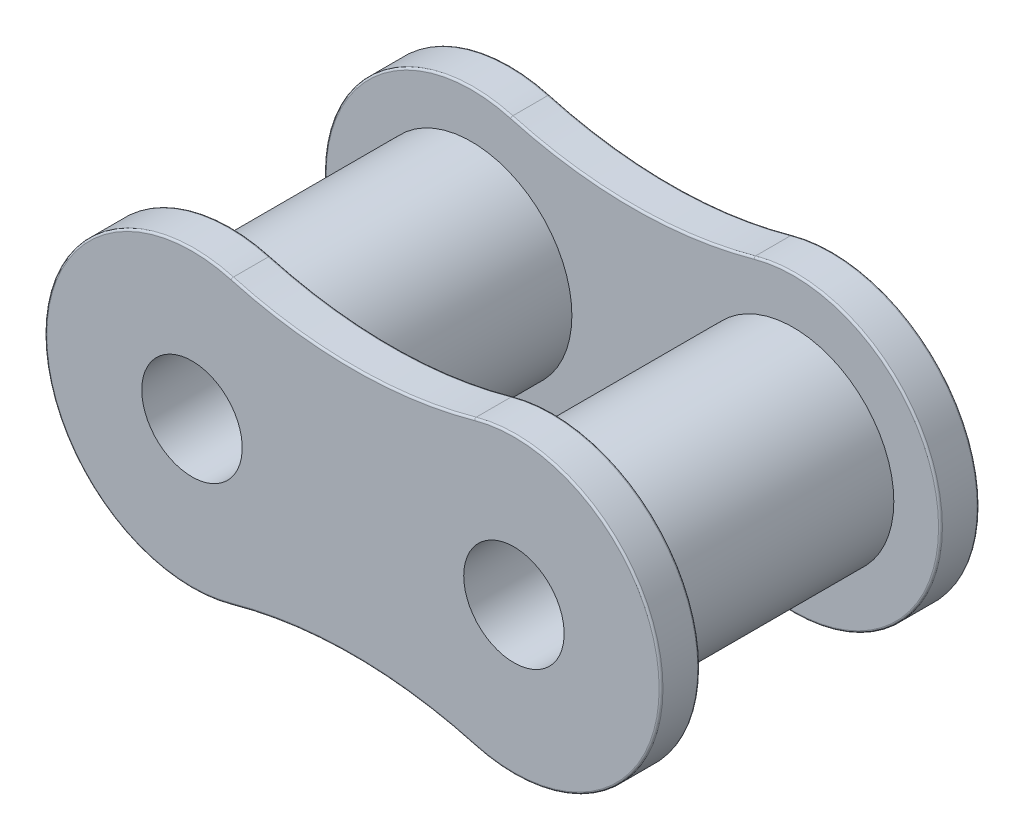
ISO-10303-21;
HEADER;
FILE_DESCRIPTION(('STEP AP214'),'2;1');
FILE_NAME('part.step','',(''),(''),'','','');
FILE_SCHEMA(('AUTOMOTIVE_DESIGN { 1 0 10303 214 1 1 1 1 }'));
ENDSEC;
DATA;
#1=APPLICATION_CONTEXT('core data for automotive mechanical design processes');
#2=APPLICATION_PROTOCOL_DEFINITION('international standard','automotive_design',2000,#1);
#3=PRODUCT_CONTEXT('',#1,'mechanical');
#4=PRODUCT('Part','Part','',(#3));
#5=PRODUCT_RELATED_PRODUCT_CATEGORY('part','',(#4));
#6=PRODUCT_DEFINITION_FORMATION('','',#4);
#7=PRODUCT_DEFINITION_CONTEXT('part definition',#1,'design');
#8=PRODUCT_DEFINITION('design','',#6,#7);
#9=PRODUCT_DEFINITION_SHAPE('','',#8);
#10=(LENGTH_UNIT() NAMED_UNIT(*) SI_UNIT(.MILLI.,.METRE.));
#11=(NAMED_UNIT(*) PLANE_ANGLE_UNIT() SI_UNIT($,.RADIAN.));
#12=(NAMED_UNIT(*) SI_UNIT($,.STERADIAN.) SOLID_ANGLE_UNIT());
#13=UNCERTAINTY_MEASURE_WITH_UNIT(LENGTH_MEASURE(1.E-05),#10,'distance_accuracy_value','');
#14=(GEOMETRIC_REPRESENTATION_CONTEXT(3) GLOBAL_UNCERTAINTY_ASSIGNED_CONTEXT((#13)) GLOBAL_UNIT_ASSIGNED_CONTEXT((#10,
#11,#12)) REPRESENTATION_CONTEXT('',''));
#15=CARTESIAN_POINT('',(0.,0.,0.));
#16=DIRECTION('',(0.,0.,1.));
#17=DIRECTION('',(1.,0.,0.));
#18=AXIS2_PLACEMENT_3D('',#15,#16,#17);
#19=CARTESIAN_POINT('',(-6.35,0.,-4.4882));
#20=DIRECTION('',(0.,0.,1.));
#21=DIRECTION('',(1.,0.,0.));
#22=AXIS2_PLACEMENT_3D('',#19,#20,#21);
#23=CYLINDRICAL_SURFACE('',#22,3.9624);
#24=CARTESIAN_POINT('',(-6.35,0.,5.353304));
#25=DIRECTION('',(0.,0.,1.));
#26=DIRECTION('',(1.,0.,0.));
#27=AXIS2_PLACEMENT_3D('',#24,#25,#26);
#28=CIRCLE('',#27,3.9624);
#29=CARTESIAN_POINT('',(-2.3876,0.,5.353304));
#30=VERTEX_POINT('',#29);
#31=EDGE_CURVE('E316',#30,#30,#28,.F.);
#32=ORIENTED_EDGE('',*,*,#31,.T.);
#33=EDGE_LOOP('',(#32));
#34=FACE_BOUND('',#33,.T.);
#35=CARTESIAN_POINT('',(-6.35,0.,-3.9878));
#36=DIRECTION('',(0.,0.,-1.));
#37=DIRECTION('',(-1.,0.,0.));
#38=AXIS2_PLACEMENT_3D('',#35,#36,#37);
#39=CIRCLE('',#38,3.9624);
#40=CARTESIAN_POINT('',(-10.3124,0.,-3.9878));
#41=VERTEX_POINT('',#40);
#42=EDGE_CURVE('E188',#41,#41,#39,.F.);
#43=ORIENTED_EDGE('',*,*,#42,.T.);
#44=EDGE_LOOP('',(#43));
#45=FACE_BOUND('',#44,.T.);
#46=ADVANCED_FACE('F49',(#34,#45),#23,.T.);
#47=CARTESIAN_POINT('',(6.35,0.,-4.4882));
#48=DIRECTION('',(0.,0.,1.));
#49=DIRECTION('',(1.,0.,0.));
#50=AXIS2_PLACEMENT_3D('',#47,#48,#49);
#51=CYLINDRICAL_SURFACE('',#50,3.9624);
#52=CARTESIAN_POINT('',(6.35,0.,5.353304));
#53=DIRECTION('',(0.,0.,1.));
#54=DIRECTION('',(1.,0.,0.));
#55=AXIS2_PLACEMENT_3D('',#52,#53,#54);
#56=CIRCLE('',#55,3.9624);
#57=CARTESIAN_POINT('',(10.3124,0.,5.353304));
#58=VERTEX_POINT('',#57);
#59=EDGE_CURVE('E303',#58,#58,#56,.F.);
#60=ORIENTED_EDGE('',*,*,#59,.T.);
#61=EDGE_LOOP('',(#60));
#62=FACE_BOUND('',#61,.T.);
#63=CARTESIAN_POINT('',(6.35,0.,-3.9878));
#64=DIRECTION('',(0.,0.,-1.));
#65=DIRECTION('',(-1.,0.,0.));
#66=AXIS2_PLACEMENT_3D('',#63,#64,#65);
#67=CIRCLE('',#66,3.9624);
#68=CARTESIAN_POINT('',(2.3876,0.,-3.9878));
#69=VERTEX_POINT('',#68);
#70=EDGE_CURVE('E199',#69,#69,#67,.T.);
#71=ORIENTED_EDGE('',*,*,#70,.F.);
#72=EDGE_LOOP('',(#71));
#73=FACE_BOUND('',#72,.T.);
#74=ADVANCED_FACE('F459',(#62,#73),#51,.T.);
#75=CARTESIAN_POINT('',(-6.35,0.,5.353304));
#76=DIRECTION('',(0.,0.,1.));
#77=DIRECTION('',(1.,0.,0.));
#78=AXIS2_PLACEMENT_3D('',#75,#76,#77);
#79=TOROIDAL_SURFACE('',#78,3.803904,0.158496);
#80=ORIENTED_EDGE('',*,*,#31,.F.);
#81=EDGE_LOOP('',(#80));
#82=FACE_BOUND('',#81,.T.);
#83=CARTESIAN_POINT('',(-6.35,0.,5.5118));
#84=DIRECTION('',(0.,0.,1.));
#85=DIRECTION('',(1.,0.,0.));
#86=AXIS2_PLACEMENT_3D('',#83,#84,#85);
#87=CIRCLE('',#86,3.803904);
#88=CARTESIAN_POINT('',(-2.546096,0.,5.5118));
#89=VERTEX_POINT('',#88);
#90=EDGE_CURVE('E331',#89,#89,#87,.T.);
#91=ORIENTED_EDGE('',*,*,#90,.F.);
#92=EDGE_LOOP('',(#91));
#93=FACE_BOUND('',#92,.T.);
#94=ADVANCED_FACE('F465',(#82,#93),#79,.T.);
#95=CARTESIAN_POINT('',(-3.175,-11.3614930643691,7.0358));
#96=DIRECTION('',(0.,0.,1.));
#97=DIRECTION('',(1.,0.,0.));
#98=AXIS2_PLACEMENT_3D('',#95,#96,#97);
#99=PLANE('',#98);
#100=CARTESIAN_POINT('',(6.35,0.,7.0358));
#101=DIRECTION('',(0.,0.,1.));
#102=DIRECTION('',(1.,0.,0.));
#103=AXIS2_PLACEMENT_3D('',#100,#101,#102);
#104=CIRCLE('',#103,5.7277);
#105=CARTESIAN_POINT('',(4.80844044542717,-5.51635218506807,7.0358));
#106=VERTEX_POINT('',#105);
#107=CARTESIAN_POINT('',(4.80844044542717,5.51635218506807,7.0358));
#108=VERTEX_POINT('',#107);
#109=EDGE_CURVE('E67',#106,#108,#104,.T.);
#110=ORIENTED_EDGE('',*,*,#109,.T.);
#111=CARTESIAN_POINT('',(0.,22.7229861287381,7.0358));
#112=DIRECTION('',(0.,0.,1.));
#113=DIRECTION('',(1.,0.,0.));
#114=AXIS2_PLACEMENT_3D('',#111,#112,#113);
#115=CIRCLE('',#114,17.8658711287381);
#116=CARTESIAN_POINT('',(-4.80844044542718,5.51635218506807,7.0358));
#117=VERTEX_POINT('',#116);
#118=EDGE_CURVE('E175',#108,#117,#115,.F.);
#119=ORIENTED_EDGE('',*,*,#118,.T.);
#120=CARTESIAN_POINT('',(-6.35,0.,7.0358));
#121=DIRECTION('',(0.,0.,1.));
#122=DIRECTION('',(1.,0.,0.));
#123=AXIS2_PLACEMENT_3D('',#120,#121,#122);
#124=CIRCLE('',#123,5.7277);
#125=CARTESIAN_POINT('',(-4.80844044542717,-5.51635218506807,7.0358));
#126=VERTEX_POINT('',#125);
#127=EDGE_CURVE('E253',#117,#126,#124,.T.);
#128=ORIENTED_EDGE('',*,*,#127,.T.);
#129=CARTESIAN_POINT('',(0.,-22.7229861287381,7.0358));
#130=DIRECTION('',(0.,0.,1.));
#131=DIRECTION('',(1.,0.,0.));
#132=AXIS2_PLACEMENT_3D('',#129,#130,#131);
#133=CIRCLE('',#132,17.8658711287381);
#134=EDGE_CURVE('E72',#126,#106,#133,.F.);
#135=ORIENTED_EDGE('',*,*,#134,.T.);
#136=EDGE_LOOP('',(#110,#119,#128,#135));
#137=FACE_BOUND('',#136,.T.);
#138=CARTESIAN_POINT('',(-6.35,0.,7.0358));
#139=DIRECTION('',(0.,0.,-1.));
#140=DIRECTION('',(-1.,0.,0.));
#141=AXIS2_PLACEMENT_3D('',#138,#139,#140);
#142=CIRCLE('',#141,1.9812);
#143=CARTESIAN_POINT('',(-8.3312,0.,7.0358));
#144=VERTEX_POINT('',#143);
#145=EDGE_CURVE('E238',#144,#144,#142,.T.);
#146=ORIENTED_EDGE('',*,*,#145,.T.);
#147=EDGE_LOOP('',(#146));
#148=FACE_BOUND('',#147,.T.);
#149=CARTESIAN_POINT('',(6.35,0.,7.0358));
#150=DIRECTION('',(0.,0.,-1.));
#151=DIRECTION('',(-1.,0.,0.));
#152=AXIS2_PLACEMENT_3D('',#149,#150,#151);
#153=CIRCLE('',#152,1.9812);
#154=CARTESIAN_POINT('',(4.3688,0.,7.0358));
#155=VERTEX_POINT('',#154);
#156=EDGE_CURVE('E705',#155,#155,#153,.T.);
#157=ORIENTED_EDGE('',*,*,#156,.T.);
#158=EDGE_LOOP('',(#157));
#159=FACE_BOUND('',#158,.T.);
#160=ADVANCED_FACE('F454',(#137,#148,#159),#99,.T.);
#161=CARTESIAN_POINT('',(-3.175,-11.3614930643691,5.5118));
#162=DIRECTION('',(0.,0.,1.));
#163=DIRECTION('',(1.,0.,0.));
#164=AXIS2_PLACEMENT_3D('',#161,#162,#163);
#165=PLANE('',#164);
#166=CARTESIAN_POINT('',(0.,-22.7229861287381,5.5118));
#167=DIRECTION('',(0.,0.,1.));
#168=DIRECTION('',(1.,0.,0.));
#169=AXIS2_PLACEMENT_3D('',#166,#167,#168);
#170=CIRCLE('',#169,17.8658711287381);
#171=CARTESIAN_POINT('',(4.80844044542717,-5.51635218506806,5.5118));
#172=VERTEX_POINT('',#171);
#173=CARTESIAN_POINT('',(-4.80844044542717,-5.51635218506807,5.5118));
#174=VERTEX_POINT('',#173);
#175=EDGE_CURVE('E388',#172,#174,#170,.T.);
#176=ORIENTED_EDGE('',*,*,#175,.T.);
#177=CARTESIAN_POINT('',(-6.35,0.,5.5118));
#178=DIRECTION('',(0.,0.,1.));
#179=DIRECTION('',(1.,0.,0.));
#180=AXIS2_PLACEMENT_3D('',#177,#178,#179);
#181=CIRCLE('',#180,5.7277);
#182=CARTESIAN_POINT('',(-4.80844044542718,5.51635218506807,5.5118));
#183=VERTEX_POINT('',#182);
#184=EDGE_CURVE('E391',#174,#183,#181,.F.);
#185=ORIENTED_EDGE('',*,*,#184,.T.);
#186=CARTESIAN_POINT('',(0.,22.7229861287381,5.5118));
#187=DIRECTION('',(0.,0.,1.));
#188=DIRECTION('',(1.,0.,0.));
#189=AXIS2_PLACEMENT_3D('',#186,#187,#188);
#190=CIRCLE('',#189,17.8658711287381);
#191=CARTESIAN_POINT('',(4.80844044542717,5.51635218506807,5.5118));
#192=VERTEX_POINT('',#191);
#193=EDGE_CURVE('E382',#183,#192,#190,.T.);
#194=ORIENTED_EDGE('',*,*,#193,.T.);
#195=CARTESIAN_POINT('',(6.35,0.,5.5118));
#196=DIRECTION('',(0.,0.,1.));
#197=DIRECTION('',(1.,0.,0.));
#198=AXIS2_PLACEMENT_3D('',#195,#196,#197);
#199=CIRCLE('',#198,5.7277);
#200=EDGE_CURVE('E385',#192,#172,#199,.F.);
#201=ORIENTED_EDGE('',*,*,#200,.T.);
#202=EDGE_LOOP('',(#176,#185,#194,#201));
#203=FACE_BOUND('',#202,.T.);
#204=CARTESIAN_POINT('',(6.35,0.,5.5118));
#205=DIRECTION('',(0.,0.,1.));
#206=DIRECTION('',(1.,0.,0.));
#207=AXIS2_PLACEMENT_3D('',#204,#205,#206);
#208=CIRCLE('',#207,3.803904);
#209=CARTESIAN_POINT('',(10.153904,0.,5.5118));
#210=VERTEX_POINT('',#209);
#211=EDGE_CURVE('E307',#210,#210,#208,.T.);
#212=ORIENTED_EDGE('',*,*,#211,.T.);
#213=EDGE_LOOP('',(#212));
#214=FACE_BOUND('',#213,.T.);
#215=ORIENTED_EDGE('',*,*,#90,.T.);
#216=EDGE_LOOP('',(#215));
#217=FACE_BOUND('',#216,.T.);
#218=ADVANCED_FACE('F433',(#203,#214,#217),#165,.F.);
#219=CARTESIAN_POINT('',(0.,-22.7229861287381,7.0358));
#220=DIRECTION('',(0.,0.,-1.));
#221=DIRECTION('',(-1.,0.,0.));
#222=AXIS2_PLACEMENT_3D('',#219,#220,#221);
#223=CYLINDRICAL_SURFACE('',#222,17.7896711287381);
#224=DIRECTION('',(0.,0.,-1.));
#225=VECTOR('',#224,1.);
#226=CARTESIAN_POINT('',(-4.78793189259471,-5.58974046247474,7.0358));
#227=LINE('',#226,#225);
#228=CARTESIAN_POINT('',(-4.78793189259471,-5.58974046247474,6.9596));
#229=VERTEX_POINT('',#228);
#230=CARTESIAN_POINT('',(-4.78793189259471,-5.58974046247474,5.588));
#231=VERTEX_POINT('',#230);
#232=EDGE_CURVE('E311',#229,#231,#227,.T.);
#233=ORIENTED_EDGE('',*,*,#232,.T.);
#234=CARTESIAN_POINT('',(0.,-22.7229861287381,5.588));
#235=DIRECTION('',(0.,0.,1.));
#236=DIRECTION('',(1.,0.,0.));
#237=AXIS2_PLACEMENT_3D('',#234,#235,#236);
#238=CIRCLE('',#237,17.7896711287381);
#239=CARTESIAN_POINT('',(4.78793189259472,-5.58974046247474,5.588));
#240=VERTEX_POINT('',#239);
#241=EDGE_CURVE('E397',#231,#240,#238,.F.);
#242=ORIENTED_EDGE('',*,*,#241,.T.);
#243=DIRECTION('',(0.,0.,-1.));
#244=VECTOR('',#243,1.);
#245=CARTESIAN_POINT('',(4.78793189259472,-5.58974046247474,7.0358));
#246=LINE('',#245,#244);
#247=CARTESIAN_POINT('',(4.78793189259472,-5.58974046247474,6.9596));
#248=VERTEX_POINT('',#247);
#249=EDGE_CURVE('E312',#248,#240,#246,.T.);
#250=ORIENTED_EDGE('',*,*,#249,.F.);
#251=CARTESIAN_POINT('',(0.,-22.7229861287381,6.9596));
#252=DIRECTION('',(0.,0.,1.));
#253=DIRECTION('',(1.,0.,0.));
#254=AXIS2_PLACEMENT_3D('',#251,#252,#253);
#255=CIRCLE('',#254,17.7896711287381);
#256=EDGE_CURVE('E257',#248,#229,#255,.T.);
#257=ORIENTED_EDGE('',*,*,#256,.T.);
#258=EDGE_LOOP('',(#233,#242,#250,#257));
#259=FACE_BOUND('',#258,.T.);
#260=ADVANCED_FACE('F446',(#259),#223,.F.);
#261=CARTESIAN_POINT('',(6.35,0.,7.0358));
#262=DIRECTION('',(0.,0.,-1.));
#263=DIRECTION('',(-1.,0.,0.));
#264=AXIS2_PLACEMENT_3D('',#261,#262,#263);
#265=CYLINDRICAL_SURFACE('',#264,5.8039);
#266=ORIENTED_EDGE('',*,*,#249,.T.);
#267=CARTESIAN_POINT('',(6.35,0.,5.588));
#268=DIRECTION('',(0.,0.,1.));
#269=DIRECTION('',(1.,0.,0.));
#270=AXIS2_PLACEMENT_3D('',#267,#268,#269);
#271=CIRCLE('',#270,5.8039);
#272=CARTESIAN_POINT('',(4.78793189259472,5.58974046247474,5.588));
#273=VERTEX_POINT('',#272);
#274=EDGE_CURVE('E403',#240,#273,#271,.T.);
#275=ORIENTED_EDGE('',*,*,#274,.T.);
#276=DIRECTION('',(0.,0.,-1.));
#277=VECTOR('',#276,1.);
#278=CARTESIAN_POINT('',(4.78793189259472,5.58974046247474,7.0358));
#279=LINE('',#278,#277);
#280=CARTESIAN_POINT('',(4.78793189259472,5.58974046247474,6.9596));
#281=VERTEX_POINT('',#280);
#282=EDGE_CURVE('E317',#281,#273,#279,.T.);
#283=ORIENTED_EDGE('',*,*,#282,.F.);
#284=CARTESIAN_POINT('',(6.35,0.,6.9596));
#285=DIRECTION('',(0.,0.,1.));
#286=DIRECTION('',(1.,0.,0.));
#287=AXIS2_PLACEMENT_3D('',#284,#285,#286);
#288=CIRCLE('',#287,5.8039);
#289=EDGE_CURVE('E400',#281,#248,#288,.F.);
#290=ORIENTED_EDGE('',*,*,#289,.T.);
#291=EDGE_LOOP('',(#266,#275,#283,#290));
#292=FACE_BOUND('',#291,.T.);
#293=ADVANCED_FACE('F418',(#292),#265,.T.);
#294=CARTESIAN_POINT('',(0.,22.7229861287381,7.0358));
#295=DIRECTION('',(0.,0.,-1.));
#296=DIRECTION('',(-1.,0.,0.));
#297=AXIS2_PLACEMENT_3D('',#294,#295,#296);
#298=CYLINDRICAL_SURFACE('',#297,17.7896711287381);
#299=DIRECTION('',(0.,0.,-1.));
#300=VECTOR('',#299,1.);
#301=CARTESIAN_POINT('',(-4.78793189259472,5.58974046247474,7.0358));
#302=LINE('',#301,#300);
#303=CARTESIAN_POINT('',(-4.78793189259472,5.58974046247474,6.9596));
#304=VERTEX_POINT('',#303);
#305=CARTESIAN_POINT('',(-4.78793189259472,5.58974046247474,5.588));
#306=VERTEX_POINT('',#305);
#307=EDGE_CURVE('E321',#304,#306,#302,.T.);
#308=ORIENTED_EDGE('',*,*,#307,.F.);
#309=CARTESIAN_POINT('',(0.,22.7229861287381,6.9596));
#310=DIRECTION('',(0.,0.,1.));
#311=DIRECTION('',(1.,0.,0.));
#312=AXIS2_PLACEMENT_3D('',#309,#310,#311);
#313=CIRCLE('',#312,17.7896711287381);
#314=EDGE_CURVE('E263',#304,#281,#313,.T.);
#315=ORIENTED_EDGE('',*,*,#314,.T.);
#316=ORIENTED_EDGE('',*,*,#282,.T.);
#317=CARTESIAN_POINT('',(0.,22.7229861287381,5.588));
#318=DIRECTION('',(0.,0.,1.));
#319=DIRECTION('',(1.,0.,0.));
#320=AXIS2_PLACEMENT_3D('',#317,#318,#319);
#321=CIRCLE('',#320,17.7896711287381);
#322=EDGE_CURVE('E406',#273,#306,#321,.F.);
#323=ORIENTED_EDGE('',*,*,#322,.T.);
#324=EDGE_LOOP('',(#308,#315,#316,#323));
#325=FACE_BOUND('',#324,.T.);
#326=ADVANCED_FACE('F414',(#325),#298,.F.);
#327=CARTESIAN_POINT('',(-6.35,0.,7.0358));
#328=DIRECTION('',(0.,0.,-1.));
#329=DIRECTION('',(-1.,0.,0.));
#330=AXIS2_PLACEMENT_3D('',#327,#328,#329);
#331=CYLINDRICAL_SURFACE('',#330,5.8039);
#332=ORIENTED_EDGE('',*,*,#307,.T.);
#333=CARTESIAN_POINT('',(-6.35,0.,5.588));
#334=DIRECTION('',(0.,0.,1.));
#335=DIRECTION('',(1.,0.,0.));
#336=AXIS2_PLACEMENT_3D('',#333,#334,#335);
#337=CIRCLE('',#336,5.8039);
#338=EDGE_CURVE('E378',#306,#231,#337,.T.);
#339=ORIENTED_EDGE('',*,*,#338,.T.);
#340=ORIENTED_EDGE('',*,*,#232,.F.);
#341=CARTESIAN_POINT('',(-6.35,0.,6.9596));
#342=DIRECTION('',(0.,0.,1.));
#343=DIRECTION('',(1.,0.,0.));
#344=AXIS2_PLACEMENT_3D('',#341,#342,#343);
#345=CIRCLE('',#344,5.8039);
#346=EDGE_CURVE('E254',#229,#304,#345,.F.);
#347=ORIENTED_EDGE('',*,*,#346,.T.);
#348=EDGE_LOOP('',(#332,#339,#340,#347));
#349=FACE_BOUND('',#348,.T.);
#350=ADVANCED_FACE('F443',(#349),#331,.T.);
#351=CARTESIAN_POINT('',(6.35,0.,5.353304));
#352=DIRECTION('',(0.,0.,1.));
#353=DIRECTION('',(1.,0.,0.));
#354=AXIS2_PLACEMENT_3D('',#351,#352,#353);
#355=TOROIDAL_SURFACE('',#354,3.803904,0.158496);
#356=ORIENTED_EDGE('',*,*,#211,.F.);
#357=EDGE_LOOP('',(#356));
#358=FACE_BOUND('',#357,.T.);
#359=ORIENTED_EDGE('',*,*,#59,.F.);
#360=EDGE_LOOP('',(#359));
#361=FACE_BOUND('',#360,.T.);
#362=ADVANCED_FACE('F621',(#358,#361),#355,.T.);
#363=CARTESIAN_POINT('',(-3.175,11.3614930643691,-3.9878));
#364=DIRECTION('',(0.,0.,-1.));
#365=DIRECTION('',(-1.,0.,0.));
#366=AXIS2_PLACEMENT_3D('',#363,#364,#365);
#367=PLANE('',#366);
#368=CARTESIAN_POINT('',(6.35,0.,-3.9878));
#369=DIRECTION('',(0.,0.,-1.));
#370=DIRECTION('',(-1.,0.,0.));
#371=AXIS2_PLACEMENT_3D('',#368,#369,#370);
#372=CIRCLE('',#371,5.7277);
#373=CARTESIAN_POINT('',(4.80844044542717,-5.51635218506807,-3.9878));
#374=VERTEX_POINT('',#373);
#375=CARTESIAN_POINT('',(4.80844044542717,5.51635218506807,-3.9878));
#376=VERTEX_POINT('',#375);
#377=EDGE_CURVE('E370',#374,#376,#372,.F.);
#378=ORIENTED_EDGE('',*,*,#377,.T.);
#379=CARTESIAN_POINT('',(0.,22.7229861287381,-3.9878));
#380=DIRECTION('',(0.,0.,-1.));
#381=DIRECTION('',(-1.,0.,0.));
#382=AXIS2_PLACEMENT_3D('',#379,#380,#381);
#383=CIRCLE('',#382,17.8658711287381);
#384=CARTESIAN_POINT('',(-4.80844044542717,5.51635218506807,-3.9878));
#385=VERTEX_POINT('',#384);
#386=EDGE_CURVE('E373',#376,#385,#383,.T.);
#387=ORIENTED_EDGE('',*,*,#386,.T.);
#388=CARTESIAN_POINT('',(-6.35,0.,-3.9878));
#389=DIRECTION('',(0.,0.,-1.));
#390=DIRECTION('',(-1.,0.,0.));
#391=AXIS2_PLACEMENT_3D('',#388,#389,#390);
#392=CIRCLE('',#391,5.7277);
#393=CARTESIAN_POINT('',(-4.80844044542717,-5.51635218506807,-3.9878));
#394=VERTEX_POINT('',#393);
#395=EDGE_CURVE('E202',#385,#394,#392,.F.);
#396=ORIENTED_EDGE('',*,*,#395,.T.);
#397=CARTESIAN_POINT('',(0.,-22.7229861287381,-3.9878));
#398=DIRECTION('',(0.,0.,-1.));
#399=DIRECTION('',(-1.,0.,0.));
#400=AXIS2_PLACEMENT_3D('',#397,#398,#399);
#401=CIRCLE('',#400,17.8658711287381);
#402=EDGE_CURVE('E367',#394,#374,#401,.T.);
#403=ORIENTED_EDGE('',*,*,#402,.T.);
#404=EDGE_LOOP('',(#378,#387,#396,#403));
#405=FACE_BOUND('',#404,.T.);
#406=ORIENTED_EDGE('',*,*,#70,.T.);
#407=EDGE_LOOP('',(#406));
#408=FACE_BOUND('',#407,.T.);
#409=ORIENTED_EDGE('',*,*,#42,.F.);
#410=EDGE_LOOP('',(#409));
#411=FACE_BOUND('',#410,.T.);
#412=ADVANCED_FACE('F617',(#405,#408,#411),#367,.F.);
#413=CARTESIAN_POINT('',(-3.175,11.3614930643691,-5.5118));
#414=DIRECTION('',(0.,0.,-1.));
#415=DIRECTION('',(-1.,0.,0.));
#416=AXIS2_PLACEMENT_3D('',#413,#414,#415);
#417=PLANE('',#416);
#418=CARTESIAN_POINT('',(-6.35,0.,-5.5118));
#419=DIRECTION('',(0.,0.,-1.));
#420=DIRECTION('',(-1.,0.,0.));
#421=AXIS2_PLACEMENT_3D('',#418,#419,#420);
#422=CIRCLE('',#421,5.7277);
#423=CARTESIAN_POINT('',(-4.80844044542717,-5.51635218506807,-5.5118));
#424=VERTEX_POINT('',#423);
#425=CARTESIAN_POINT('',(-4.80844044542717,5.51635218506807,-5.5118));
#426=VERTEX_POINT('',#425);
#427=EDGE_CURVE('E340',#424,#426,#422,.T.);
#428=ORIENTED_EDGE('',*,*,#427,.T.);
#429=CARTESIAN_POINT('',(0.,22.7229861287381,-5.5118));
#430=DIRECTION('',(0.,0.,-1.));
#431=DIRECTION('',(-1.,0.,0.));
#432=AXIS2_PLACEMENT_3D('',#429,#430,#431);
#433=CIRCLE('',#432,17.8658711287381);
#434=CARTESIAN_POINT('',(4.80844044542717,5.51635218506807,-5.5118));
#435=VERTEX_POINT('',#434);
#436=EDGE_CURVE('E349',#426,#435,#433,.F.);
#437=ORIENTED_EDGE('',*,*,#436,.T.);
#438=CARTESIAN_POINT('',(6.35,0.,-5.5118));
#439=DIRECTION('',(0.,0.,-1.));
#440=DIRECTION('',(-1.,0.,0.));
#441=AXIS2_PLACEMENT_3D('',#438,#439,#440);
#442=CIRCLE('',#441,5.7277);
#443=CARTESIAN_POINT('',(4.80844044542717,-5.51635218506807,-5.5118));
#444=VERTEX_POINT('',#443);
#445=EDGE_CURVE('E346',#435,#444,#442,.T.);
#446=ORIENTED_EDGE('',*,*,#445,.T.);
#447=CARTESIAN_POINT('',(0.,-22.7229861287381,-5.5118));
#448=DIRECTION('',(0.,0.,-1.));
#449=DIRECTION('',(-1.,0.,0.));
#450=AXIS2_PLACEMENT_3D('',#447,#448,#449);
#451=CIRCLE('',#450,17.8658711287381);
#452=EDGE_CURVE('E343',#444,#424,#451,.F.);
#453=ORIENTED_EDGE('',*,*,#452,.T.);
#454=EDGE_LOOP('',(#428,#437,#446,#453));
#455=FACE_BOUND('',#454,.T.);
#456=CARTESIAN_POINT('',(-6.35,0.,-5.5118));
#457=DIRECTION('',(0.,0.,-1.));
#458=DIRECTION('',(-1.,0.,0.));
#459=AXIS2_PLACEMENT_3D('',#456,#457,#458);
#460=CIRCLE('',#459,1.9812);
#461=CARTESIAN_POINT('',(-8.3312,0.,-5.5118));
#462=VERTEX_POINT('',#461);
#463=EDGE_CURVE('E702',#462,#462,#460,.T.);
#464=ORIENTED_EDGE('',*,*,#463,.F.);
#465=EDGE_LOOP('',(#464));
#466=FACE_BOUND('',#465,.T.);
#467=CARTESIAN_POINT('',(6.35,0.,-5.5118));
#468=DIRECTION('',(0.,0.,-1.));
#469=DIRECTION('',(-1.,0.,0.));
#470=AXIS2_PLACEMENT_3D('',#467,#468,#469);
#471=CIRCLE('',#470,1.9812);
#472=CARTESIAN_POINT('',(4.3688,0.,-5.5118));
#473=VERTEX_POINT('',#472);
#474=EDGE_CURVE('E295',#473,#473,#471,.T.);
#475=ORIENTED_EDGE('',*,*,#474,.F.);
#476=EDGE_LOOP('',(#475));
#477=FACE_BOUND('',#476,.T.);
#478=ADVANCED_FACE('F611',(#455,#466,#477),#417,.T.);
#479=CARTESIAN_POINT('',(0.,22.7229861287381,-3.9878));
#480=DIRECTION('',(0.,0.,-1.));
#481=DIRECTION('',(-1.,0.,0.));
#482=AXIS2_PLACEMENT_3D('',#479,#480,#481);
#483=CYLINDRICAL_SURFACE('',#482,17.7896711287381);
#484=DIRECTION('',(0.,0.,-1.));
#485=VECTOR('',#484,1.);
#486=CARTESIAN_POINT('',(4.78793189259471,5.58974046247474,-3.9878));
#487=LINE('',#486,#485);
#488=CARTESIAN_POINT('',(4.78793189259471,5.58974046247474,-4.064));
#489=VERTEX_POINT('',#488);
#490=CARTESIAN_POINT('',(4.78793189259471,5.58974046247474,-5.4356));
#491=VERTEX_POINT('',#490);
#492=EDGE_CURVE('E282',#489,#491,#487,.T.);
#493=ORIENTED_EDGE('',*,*,#492,.T.);
#494=CARTESIAN_POINT('',(0.,22.7229861287381,-5.4356));
#495=DIRECTION('',(0.,0.,-1.));
#496=DIRECTION('',(-1.,0.,0.));
#497=AXIS2_PLACEMENT_3D('',#494,#495,#496);
#498=CIRCLE('',#497,17.7896711287381);
#499=CARTESIAN_POINT('',(-4.78793189259471,5.58974046247474,-5.4356));
#500=VERTEX_POINT('',#499);
#501=EDGE_CURVE('E186',#491,#500,#498,.T.);
#502=ORIENTED_EDGE('',*,*,#501,.T.);
#503=DIRECTION('',(0.,0.,-1.));
#504=VECTOR('',#503,1.);
#505=CARTESIAN_POINT('',(-4.78793189259471,5.58974046247474,-3.9878));
#506=LINE('',#505,#504);
#507=CARTESIAN_POINT('',(-4.78793189259471,5.58974046247474,-4.064));
#508=VERTEX_POINT('',#507);
#509=EDGE_CURVE('E167',#508,#500,#506,.T.);
#510=ORIENTED_EDGE('',*,*,#509,.F.);
#511=CARTESIAN_POINT('',(0.,22.7229861287381,-4.064));
#512=DIRECTION('',(0.,0.,-1.));
#513=DIRECTION('',(-1.,0.,0.));
#514=AXIS2_PLACEMENT_3D('',#511,#512,#513);
#515=CIRCLE('',#514,17.7896711287381);
#516=EDGE_CURVE('E183',#508,#489,#515,.F.);
#517=ORIENTED_EDGE('',*,*,#516,.T.);
#518=EDGE_LOOP('',(#493,#502,#510,#517));
#519=FACE_BOUND('',#518,.T.);
#520=ADVANCED_FACE('F182',(#519),#483,.F.);
#521=CARTESIAN_POINT('',(-6.35,0.,-3.9878));
#522=DIRECTION('',(0.,0.,-1.));
#523=DIRECTION('',(-1.,0.,0.));
#524=AXIS2_PLACEMENT_3D('',#521,#522,#523);
#525=CYLINDRICAL_SURFACE('',#524,5.8039);
#526=ORIENTED_EDGE('',*,*,#509,.T.);
#527=CARTESIAN_POINT('',(-6.35,0.,-5.4356));
#528=DIRECTION('',(0.,0.,-1.));
#529=DIRECTION('',(-1.,0.,0.));
#530=AXIS2_PLACEMENT_3D('',#527,#528,#529);
#531=CIRCLE('',#530,5.8039);
#532=CARTESIAN_POINT('',(-4.78793189259471,-5.58974046247474,-5.4356));
#533=VERTEX_POINT('',#532);
#534=EDGE_CURVE('E11',#500,#533,#531,.F.);
#535=ORIENTED_EDGE('',*,*,#534,.T.);
#536=DIRECTION('',(0.,0.,-1.));
#537=VECTOR('',#536,1.);
#538=CARTESIAN_POINT('',(-4.78793189259471,-5.58974046247474,-3.9878));
#539=LINE('',#538,#537);
#540=CARTESIAN_POINT('',(-4.78793189259471,-5.58974046247474,-4.064));
#541=VERTEX_POINT('',#540);
#542=EDGE_CURVE('E169',#541,#533,#539,.T.);
#543=ORIENTED_EDGE('',*,*,#542,.F.);
#544=CARTESIAN_POINT('',(-6.35,0.,-4.064));
#545=DIRECTION('',(0.,0.,-1.));
#546=DIRECTION('',(-1.,0.,0.));
#547=AXIS2_PLACEMENT_3D('',#544,#545,#546);
#548=CIRCLE('',#547,5.8039);
#549=EDGE_CURVE('E59',#541,#508,#548,.T.);
#550=ORIENTED_EDGE('',*,*,#549,.T.);
#551=EDGE_LOOP('',(#526,#535,#543,#550));
#552=FACE_BOUND('',#551,.T.);
#553=ADVANCED_FACE('F166',(#552),#525,.T.);
#554=CARTESIAN_POINT('',(0.,-22.7229861287381,-3.9878));
#555=DIRECTION('',(0.,0.,-1.));
#556=DIRECTION('',(-1.,0.,0.));
#557=AXIS2_PLACEMENT_3D('',#554,#555,#556);
#558=CYLINDRICAL_SURFACE('',#557,17.7896711287381);
#559=ORIENTED_EDGE('',*,*,#542,.T.);
#560=CARTESIAN_POINT('',(0.,-22.7229861287381,-5.4356));
#561=DIRECTION('',(0.,0.,-1.));
#562=DIRECTION('',(-1.,0.,0.));
#563=AXIS2_PLACEMENT_3D('',#560,#561,#562);
#564=CIRCLE('',#563,17.7896711287381);
#565=CARTESIAN_POINT('',(4.78793189259472,-5.58974046247474,-5.4356));
#566=VERTEX_POINT('',#565);
#567=EDGE_CURVE('E362',#533,#566,#564,.T.);
#568=ORIENTED_EDGE('',*,*,#567,.T.);
#569=DIRECTION('',(0.,0.,-1.));
#570=VECTOR('',#569,1.);
#571=CARTESIAN_POINT('',(4.78793189259472,-5.58974046247474,-3.9878));
#572=LINE('',#571,#570);
#573=CARTESIAN_POINT('',(4.78793189259472,-5.58974046247474,-4.064));
#574=VERTEX_POINT('',#573);
#575=EDGE_CURVE('E288',#574,#566,#572,.T.);
#576=ORIENTED_EDGE('',*,*,#575,.F.);
#577=CARTESIAN_POINT('',(0.,-22.7229861287381,-4.064));
#578=DIRECTION('',(0.,0.,-1.));
#579=DIRECTION('',(-1.,0.,0.));
#580=AXIS2_PLACEMENT_3D('',#577,#578,#579);
#581=CIRCLE('',#580,17.7896711287381);
#582=EDGE_CURVE('E359',#574,#541,#581,.F.);
#583=ORIENTED_EDGE('',*,*,#582,.T.);
#584=EDGE_LOOP('',(#559,#568,#576,#583));
#585=FACE_BOUND('',#584,.T.);
#586=ADVANCED_FACE('F587',(#585),#558,.F.);
#587=CARTESIAN_POINT('',(6.35,0.,-3.9878));
#588=DIRECTION('',(0.,0.,-1.));
#589=DIRECTION('',(-1.,0.,0.));
#590=AXIS2_PLACEMENT_3D('',#587,#588,#589);
#591=CYLINDRICAL_SURFACE('',#590,5.8039);
#592=ORIENTED_EDGE('',*,*,#575,.T.);
#593=CARTESIAN_POINT('',(6.35,0.,-5.4356));
#594=DIRECTION('',(0.,0.,-1.));
#595=DIRECTION('',(-1.,0.,0.));
#596=AXIS2_PLACEMENT_3D('',#593,#594,#595);
#597=CIRCLE('',#596,5.8039);
#598=EDGE_CURVE('E356',#566,#491,#597,.F.);
#599=ORIENTED_EDGE('',*,*,#598,.T.);
#600=ORIENTED_EDGE('',*,*,#492,.F.);
#601=CARTESIAN_POINT('',(6.35,0.,-4.064));
#602=DIRECTION('',(0.,0.,-1.));
#603=DIRECTION('',(-1.,0.,0.));
#604=AXIS2_PLACEMENT_3D('',#601,#602,#603);
#605=CIRCLE('',#604,5.8039);
#606=EDGE_CURVE('E353',#489,#574,#605,.T.);
#607=ORIENTED_EDGE('',*,*,#606,.T.);
#608=EDGE_LOOP('',(#592,#599,#600,#607));
#609=FACE_BOUND('',#608,.T.);
#610=ADVANCED_FACE('F487',(#609),#591,.T.);
#611=CARTESIAN_POINT('',(0.,-22.7229861287381,-5.4356));
#612=DIRECTION('',(0.,0.,-1.));
#613=DIRECTION('',(-1.,0.,0.));
#614=AXIS2_PLACEMENT_3D('',#611,#612,#613);
#615=TOROIDAL_SURFACE('',#614,17.8658711287381,0.0762);
#616=CARTESIAN_POINT('',(-4.80844044542717,-5.51635218506807,-5.4356));
#617=DIRECTION('',(-0.96310075336838,-0.2691411132868,0.));
#618=DIRECTION('',(0.2691411132868,-0.963100753368381,0.));
#619=AXIS2_PLACEMENT_3D('',#616,#617,#618);
#620=CIRCLE('',#619,0.0762);
#621=EDGE_CURVE('E273',#424,#533,#620,.T.);
#622=ORIENTED_EDGE('',*,*,#621,.F.);
#623=ORIENTED_EDGE('',*,*,#452,.F.);
#624=CARTESIAN_POINT('',(4.80844044542717,-5.51635218506807,-5.4356));
#625=DIRECTION('',(0.96310075336838,-0.2691411132868,0.));
#626=DIRECTION('',(0.2691411132868,0.963100753368381,0.));
#627=AXIS2_PLACEMENT_3D('',#624,#625,#626);
#628=CIRCLE('',#627,0.0762);
#629=EDGE_CURVE('E215',#566,#444,#628,.T.);
#630=ORIENTED_EDGE('',*,*,#629,.F.);
#631=ORIENTED_EDGE('',*,*,#567,.F.);
#632=EDGE_LOOP('',(#622,#623,#630,#631));
#633=FACE_BOUND('',#632,.T.);
#634=ADVANCED_FACE('F484',(#633),#615,.T.);
#635=CARTESIAN_POINT('',(6.35,0.,-5.4356));
#636=DIRECTION('',(0.,0.,-1.));
#637=DIRECTION('',(-1.,0.,0.));
#638=AXIS2_PLACEMENT_3D('',#635,#636,#637);
#639=TOROIDAL_SURFACE('',#638,5.7277,0.0762);
#640=ORIENTED_EDGE('',*,*,#629,.T.);
#641=ORIENTED_EDGE('',*,*,#445,.F.);
#642=CARTESIAN_POINT('',(4.80844044542717,5.51635218506807,-5.4356));
#643=DIRECTION('',(-0.96310075336838,-0.2691411132868,0.));
#644=DIRECTION('',(0.2691411132868,-0.963100753368381,0.));
#645=AXIS2_PLACEMENT_3D('',#642,#643,#644);
#646=CIRCLE('',#645,0.0762);
#647=EDGE_CURVE('E271',#491,#435,#646,.T.);
#648=ORIENTED_EDGE('',*,*,#647,.F.);
#649=ORIENTED_EDGE('',*,*,#598,.F.);
#650=EDGE_LOOP('',(#640,#641,#648,#649));
#651=FACE_BOUND('',#650,.T.);
#652=ADVANCED_FACE('F481',(#651),#639,.T.);
#653=CARTESIAN_POINT('',(-6.35,0.,-5.4356));
#654=DIRECTION('',(0.,0.,-1.));
#655=DIRECTION('',(-1.,0.,0.));
#656=AXIS2_PLACEMENT_3D('',#653,#654,#655);
#657=TOROIDAL_SURFACE('',#656,5.7277,0.0762);
#658=ORIENTED_EDGE('',*,*,#621,.T.);
#659=ORIENTED_EDGE('',*,*,#534,.F.);
#660=CARTESIAN_POINT('',(-4.80844044542717,5.51635218506807,-5.4356));
#661=DIRECTION('',(0.96310075336838,-0.2691411132868,0.));
#662=DIRECTION('',(0.2691411132868,0.963100753368381,0.));
#663=AXIS2_PLACEMENT_3D('',#660,#661,#662);
#664=CIRCLE('',#663,0.0762);
#665=EDGE_CURVE('E224',#426,#500,#664,.T.);
#666=ORIENTED_EDGE('',*,*,#665,.F.);
#667=ORIENTED_EDGE('',*,*,#427,.F.);
#668=EDGE_LOOP('',(#658,#659,#666,#667));
#669=FACE_BOUND('',#668,.T.);
#670=ADVANCED_FACE('F477',(#669),#657,.T.);
#671=CARTESIAN_POINT('',(0.,22.7229861287381,-5.4356));
#672=DIRECTION('',(0.,0.,-1.));
#673=DIRECTION('',(-1.,0.,0.));
#674=AXIS2_PLACEMENT_3D('',#671,#672,#673);
#675=TOROIDAL_SURFACE('',#674,17.8658711287381,0.0762);
#676=ORIENTED_EDGE('',*,*,#647,.T.);
#677=ORIENTED_EDGE('',*,*,#436,.F.);
#678=ORIENTED_EDGE('',*,*,#665,.T.);
#679=ORIENTED_EDGE('',*,*,#501,.F.);
#680=EDGE_LOOP('',(#676,#677,#678,#679));
#681=FACE_BOUND('',#680,.T.);
#682=ADVANCED_FACE('F473',(#681),#675,.T.);
#683=CARTESIAN_POINT('',(0.,-22.7229861287381,-4.064));
#684=DIRECTION('',(0.,0.,-1.));
#685=DIRECTION('',(-1.,0.,0.));
#686=AXIS2_PLACEMENT_3D('',#683,#684,#685);
#687=TOROIDAL_SURFACE('',#686,17.8658711287381,0.0762);
#688=CARTESIAN_POINT('',(-4.80844044542717,-5.51635218506807,-4.064));
#689=DIRECTION('',(-0.96310075336838,-0.2691411132868,0.));
#690=DIRECTION('',(0.2691411132868,-0.963100753368381,0.));
#691=AXIS2_PLACEMENT_3D('',#688,#689,#690);
#692=CIRCLE('',#691,0.0762);
#693=EDGE_CURVE('E209',#541,#394,#692,.T.);
#694=ORIENTED_EDGE('',*,*,#693,.F.);
#695=ORIENTED_EDGE('',*,*,#582,.F.);
#696=CARTESIAN_POINT('',(4.80844044542717,-5.51635218506807,-4.064));
#697=DIRECTION('',(0.96310075336838,-0.2691411132868,0.));
#698=DIRECTION('',(0.2691411132868,0.963100753368381,0.));
#699=AXIS2_PLACEMENT_3D('',#696,#697,#698);
#700=CIRCLE('',#699,0.0762);
#701=EDGE_CURVE('E220',#374,#574,#700,.T.);
#702=ORIENTED_EDGE('',*,*,#701,.F.);
#703=ORIENTED_EDGE('',*,*,#402,.F.);
#704=EDGE_LOOP('',(#694,#695,#702,#703));
#705=FACE_BOUND('',#704,.T.);
#706=ADVANCED_FACE('F476',(#705),#687,.T.);
#707=CARTESIAN_POINT('',(6.35,0.,-4.064));
#708=DIRECTION('',(0.,0.,-1.));
#709=DIRECTION('',(-1.,0.,0.));
#710=AXIS2_PLACEMENT_3D('',#707,#708,#709);
#711=TOROIDAL_SURFACE('',#710,5.7277,0.0762);
#712=ORIENTED_EDGE('',*,*,#701,.T.);
#713=ORIENTED_EDGE('',*,*,#606,.F.);
#714=CARTESIAN_POINT('',(4.80844044542717,5.51635218506807,-4.064));
#715=DIRECTION('',(-0.96310075336838,-0.2691411132868,0.));
#716=DIRECTION('',(0.2691411132868,-0.963100753368381,0.));
#717=AXIS2_PLACEMENT_3D('',#714,#715,#716);
#718=CIRCLE('',#717,0.0762);
#719=EDGE_CURVE('E196',#376,#489,#718,.T.);
#720=ORIENTED_EDGE('',*,*,#719,.F.);
#721=ORIENTED_EDGE('',*,*,#377,.F.);
#722=EDGE_LOOP('',(#712,#713,#720,#721));
#723=FACE_BOUND('',#722,.T.);
#724=ADVANCED_FACE('F493',(#723),#711,.T.);
#725=CARTESIAN_POINT('',(-6.35,0.,-4.064));
#726=DIRECTION('',(0.,0.,-1.));
#727=DIRECTION('',(-1.,0.,0.));
#728=AXIS2_PLACEMENT_3D('',#725,#726,#727);
#729=TOROIDAL_SURFACE('',#728,5.7277,0.0762);
#730=ORIENTED_EDGE('',*,*,#693,.T.);
#731=ORIENTED_EDGE('',*,*,#395,.F.);
#732=CARTESIAN_POINT('',(-4.80844044542717,5.51635218506807,-4.064));
#733=DIRECTION('',(0.96310075336838,-0.2691411132868,0.));
#734=DIRECTION('',(0.2691411132868,0.963100753368381,0.));
#735=AXIS2_PLACEMENT_3D('',#732,#733,#734);
#736=CIRCLE('',#735,0.0762);
#737=EDGE_CURVE('E193',#508,#385,#736,.T.);
#738=ORIENTED_EDGE('',*,*,#737,.F.);
#739=ORIENTED_EDGE('',*,*,#549,.F.);
#740=EDGE_LOOP('',(#730,#731,#738,#739));
#741=FACE_BOUND('',#740,.T.);
#742=ADVANCED_FACE('F201',(#741),#729,.T.);
#743=CARTESIAN_POINT('',(0.,22.7229861287381,-4.064));
#744=DIRECTION('',(0.,0.,-1.));
#745=DIRECTION('',(-1.,0.,0.));
#746=AXIS2_PLACEMENT_3D('',#743,#744,#745);
#747=TOROIDAL_SURFACE('',#746,17.8658711287381,0.0762);
#748=ORIENTED_EDGE('',*,*,#719,.T.);
#749=ORIENTED_EDGE('',*,*,#516,.F.);
#750=ORIENTED_EDGE('',*,*,#737,.T.);
#751=ORIENTED_EDGE('',*,*,#386,.F.);
#752=EDGE_LOOP('',(#748,#749,#750,#751));
#753=FACE_BOUND('',#752,.T.);
#754=ADVANCED_FACE('F191',(#753),#747,.T.);
#755=CARTESIAN_POINT('',(6.35,0.,5.588));
#756=DIRECTION('',(0.,0.,1.));
#757=DIRECTION('',(1.,0.,0.));
#758=AXIS2_PLACEMENT_3D('',#755,#756,#757);
#759=TOROIDAL_SURFACE('',#758,5.7277,0.0762);
#760=CARTESIAN_POINT('',(4.80844044542717,-5.51635218506806,5.588));
#761=DIRECTION('',(-0.963100753368381,0.269141113286797,0.));
#762=DIRECTION('',(-0.269141113286797,-0.963100753368381,0.));
#763=AXIS2_PLACEMENT_3D('',#760,#761,#762);
#764=CIRCLE('',#763,0.0762);
#765=EDGE_CURVE('E212',#172,#240,#764,.T.);
#766=ORIENTED_EDGE('',*,*,#765,.F.);
#767=ORIENTED_EDGE('',*,*,#200,.F.);
#768=CARTESIAN_POINT('',(4.80844044542717,5.51635218506807,5.588));
#769=DIRECTION('',(-0.96310075336838,-0.2691411132868,0.));
#770=DIRECTION('',(0.2691411132868,-0.963100753368381,0.));
#771=AXIS2_PLACEMENT_3D('',#768,#769,#770);
#772=CIRCLE('',#771,0.0762);
#773=EDGE_CURVE('E205',#273,#192,#772,.T.);
#774=ORIENTED_EDGE('',*,*,#773,.F.);
#775=ORIENTED_EDGE('',*,*,#274,.F.);
#776=EDGE_LOOP('',(#766,#767,#774,#775));
#777=FACE_BOUND('',#776,.T.);
#778=ADVANCED_FACE('F423',(#777),#759,.T.);
#779=CARTESIAN_POINT('',(0.,22.7229861287381,5.588));
#780=DIRECTION('',(0.,0.,1.));
#781=DIRECTION('',(1.,0.,0.));
#782=AXIS2_PLACEMENT_3D('',#779,#780,#781);
#783=TOROIDAL_SURFACE('',#782,17.8658711287381,0.0762);
#784=ORIENTED_EDGE('',*,*,#773,.T.);
#785=ORIENTED_EDGE('',*,*,#193,.F.);
#786=CARTESIAN_POINT('',(-4.80844044542718,5.51635218506807,5.588));
#787=DIRECTION('',(-0.963100753368377,0.269141113286811,0.));
#788=DIRECTION('',(-0.269141113286811,-0.963100753368377,0.));
#789=AXIS2_PLACEMENT_3D('',#786,#787,#788);
#790=CIRCLE('',#789,0.0762);
#791=EDGE_CURVE('E228',#306,#183,#790,.T.);
#792=ORIENTED_EDGE('',*,*,#791,.F.);
#793=ORIENTED_EDGE('',*,*,#322,.F.);
#794=EDGE_LOOP('',(#784,#785,#792,#793));
#795=FACE_BOUND('',#794,.T.);
#796=ADVANCED_FACE('F441',(#795),#783,.T.);
#797=CARTESIAN_POINT('',(0.,-22.7229861287381,5.588));
#798=DIRECTION('',(0.,0.,1.));
#799=DIRECTION('',(1.,0.,0.));
#800=AXIS2_PLACEMENT_3D('',#797,#798,#799);
#801=TOROIDAL_SURFACE('',#800,17.8658711287381,0.0762);
#802=ORIENTED_EDGE('',*,*,#765,.T.);
#803=ORIENTED_EDGE('',*,*,#241,.F.);
#804=CARTESIAN_POINT('',(-4.80844044542717,-5.51635218506807,5.588));
#805=DIRECTION('',(-0.96310075336838,-0.2691411132868,0.));
#806=DIRECTION('',(0.2691411132868,-0.963100753368381,0.));
#807=AXIS2_PLACEMENT_3D('',#804,#805,#806);
#808=CIRCLE('',#807,0.0762);
#809=EDGE_CURVE('E225',#174,#231,#808,.T.);
#810=ORIENTED_EDGE('',*,*,#809,.F.);
#811=ORIENTED_EDGE('',*,*,#175,.F.);
#812=EDGE_LOOP('',(#802,#803,#810,#811));
#813=FACE_BOUND('',#812,.T.);
#814=ADVANCED_FACE('F429',(#813),#801,.T.);
#815=CARTESIAN_POINT('',(-6.35,0.,5.588));
#816=DIRECTION('',(0.,0.,1.));
#817=DIRECTION('',(1.,0.,0.));
#818=AXIS2_PLACEMENT_3D('',#815,#816,#817);
#819=TOROIDAL_SURFACE('',#818,5.7277,0.0762);
#820=ORIENTED_EDGE('',*,*,#791,.T.);
#821=ORIENTED_EDGE('',*,*,#184,.F.);
#822=ORIENTED_EDGE('',*,*,#809,.T.);
#823=ORIENTED_EDGE('',*,*,#338,.F.);
#824=EDGE_LOOP('',(#820,#821,#822,#823));
#825=FACE_BOUND('',#824,.T.);
#826=ADVANCED_FACE('F436',(#825),#819,.T.);
#827=CARTESIAN_POINT('',(0.,-22.7229861287381,6.9596));
#828=DIRECTION('',(0.,0.,1.));
#829=DIRECTION('',(1.,0.,0.));
#830=AXIS2_PLACEMENT_3D('',#827,#828,#829);
#831=TOROIDAL_SURFACE('',#830,17.8658711287381,0.0762);
#832=CARTESIAN_POINT('',(4.80844044542717,-5.51635218506807,6.9596));
#833=DIRECTION('',(0.96310075336838,-0.2691411132868,0.));
#834=DIRECTION('',(0.2691411132868,0.963100753368381,0.));
#835=AXIS2_PLACEMENT_3D('',#832,#833,#834);
#836=CIRCLE('',#835,0.0762);
#837=EDGE_CURVE('E240',#106,#248,#836,.T.);
#838=ORIENTED_EDGE('',*,*,#837,.F.);
#839=ORIENTED_EDGE('',*,*,#134,.F.);
#840=CARTESIAN_POINT('',(-4.80844044542717,-5.51635218506807,6.9596));
#841=DIRECTION('',(-0.96310075336838,-0.2691411132868,0.));
#842=DIRECTION('',(0.2691411132868,-0.963100753368381,0.));
#843=AXIS2_PLACEMENT_3D('',#840,#841,#842);
#844=CIRCLE('',#843,0.0762);
#845=EDGE_CURVE('E53',#229,#126,#844,.T.);
#846=ORIENTED_EDGE('',*,*,#845,.F.);
#847=ORIENTED_EDGE('',*,*,#256,.F.);
#848=EDGE_LOOP('',(#838,#839,#846,#847));
#849=FACE_BOUND('',#848,.T.);
#850=ADVANCED_FACE('F51',(#849),#831,.T.);
#851=CARTESIAN_POINT('',(-6.35,0.,6.9596));
#852=DIRECTION('',(0.,0.,1.));
#853=DIRECTION('',(1.,0.,0.));
#854=AXIS2_PLACEMENT_3D('',#851,#852,#853);
#855=TOROIDAL_SURFACE('',#854,5.7277,0.0762);
#856=ORIENTED_EDGE('',*,*,#845,.T.);
#857=ORIENTED_EDGE('',*,*,#127,.F.);
#858=CARTESIAN_POINT('',(-4.80844044542718,5.51635218506807,6.9596));
#859=DIRECTION('',(0.96310075336838,-0.2691411132868,0.));
#860=DIRECTION('',(0.2691411132868,0.963100753368381,0.));
#861=AXIS2_PLACEMENT_3D('',#858,#859,#860);
#862=CIRCLE('',#861,0.0762);
#863=EDGE_CURVE('E237',#304,#117,#862,.T.);
#864=ORIENTED_EDGE('',*,*,#863,.F.);
#865=ORIENTED_EDGE('',*,*,#346,.F.);
#866=EDGE_LOOP('',(#856,#857,#864,#865));
#867=FACE_BOUND('',#866,.T.);
#868=ADVANCED_FACE('F251',(#867),#855,.T.);
#869=CARTESIAN_POINT('',(6.35,0.,6.9596));
#870=DIRECTION('',(0.,0.,1.));
#871=DIRECTION('',(1.,0.,0.));
#872=AXIS2_PLACEMENT_3D('',#869,#870,#871);
#873=TOROIDAL_SURFACE('',#872,5.7277,0.0762);
#874=ORIENTED_EDGE('',*,*,#837,.T.);
#875=ORIENTED_EDGE('',*,*,#289,.F.);
#876=CARTESIAN_POINT('',(4.80844044542717,5.51635218506807,6.9596));
#877=DIRECTION('',(-0.963100753368378,-0.269141113286808,0.));
#878=DIRECTION('',(0.269141113286808,-0.963100753368378,0.));
#879=AXIS2_PLACEMENT_3D('',#876,#877,#878);
#880=CIRCLE('',#879,0.0762);
#881=EDGE_CURVE('E234',#108,#281,#880,.T.);
#882=ORIENTED_EDGE('',*,*,#881,.F.);
#883=ORIENTED_EDGE('',*,*,#109,.F.);
#884=EDGE_LOOP('',(#874,#875,#882,#883));
#885=FACE_BOUND('',#884,.T.);
#886=ADVANCED_FACE('F512',(#885),#873,.T.);
#887=CARTESIAN_POINT('',(0.,22.7229861287381,6.9596));
#888=DIRECTION('',(0.,0.,1.));
#889=DIRECTION('',(1.,0.,0.));
#890=AXIS2_PLACEMENT_3D('',#887,#888,#889);
#891=TOROIDAL_SURFACE('',#890,17.8658711287381,0.0762);
#892=ORIENTED_EDGE('',*,*,#863,.T.);
#893=ORIENTED_EDGE('',*,*,#118,.F.);
#894=ORIENTED_EDGE('',*,*,#881,.T.);
#895=ORIENTED_EDGE('',*,*,#314,.F.);
#896=EDGE_LOOP('',(#892,#893,#894,#895));
#897=FACE_BOUND('',#896,.T.);
#898=ADVANCED_FACE('F508',(#897),#891,.T.);
#899=CARTESIAN_POINT('',(-6.35,0.,7.0358));
#900=DIRECTION('',(0.,0.,-1.));
#901=DIRECTION('',(-1.,0.,0.));
#902=AXIS2_PLACEMENT_3D('',#899,#900,#901);
#903=CYLINDRICAL_SURFACE('',#902,1.9812);
#904=CARTESIAN_POINT('',(-8.3312,0.,7.0358));
#905=CARTESIAN_POINT('',(-8.3312,0.,6.90509583333333));
#906=CARTESIAN_POINT('',(-8.3312,0.,6.77439166666667));
#907=CARTESIAN_POINT('',(-8.3312,0.,6.51298333333333));
#908=CARTESIAN_POINT('',(-8.3312,0.,6.38227916666667));
#909=CARTESIAN_POINT('',(-8.3312,0.,6.12087083333333));
#910=CARTESIAN_POINT('',(-8.3312,0.,5.99016666666667));
#911=CARTESIAN_POINT('',(-8.3312,0.,5.72875833333333));
#912=CARTESIAN_POINT('',(-8.3312,0.,5.59805416666667));
#913=CARTESIAN_POINT('',(-8.3312,0.,5.33664583333333));
#914=CARTESIAN_POINT('',(-8.3312,0.,5.20594166666667));
#915=CARTESIAN_POINT('',(-8.3312,0.,4.94453333333333));
#916=CARTESIAN_POINT('',(-8.3312,0.,4.81382916666667));
#917=CARTESIAN_POINT('',(-8.3312,0.,4.55242083333333));
#918=CARTESIAN_POINT('',(-8.3312,0.,4.42171666666667));
#919=CARTESIAN_POINT('',(-8.3312,0.,4.16030833333333));
#920=CARTESIAN_POINT('',(-8.3312,0.,4.02960416666667));
#921=CARTESIAN_POINT('',(-8.3312,0.,3.76819583333333));
#922=CARTESIAN_POINT('',(-8.3312,0.,3.63749166666667));
#923=CARTESIAN_POINT('',(-8.3312,0.,3.37608333333333));
#924=CARTESIAN_POINT('',(-8.3312,0.,3.24537916666667));
#925=CARTESIAN_POINT('',(-8.3312,0.,2.98397083333334));
#926=CARTESIAN_POINT('',(-8.3312,0.,2.85326666666667));
#927=CARTESIAN_POINT('',(-8.3312,0.,2.59185833333333));
#928=CARTESIAN_POINT('',(-8.3312,0.,2.46115416666667));
#929=CARTESIAN_POINT('',(-8.3312,0.,2.19974583333333));
#930=CARTESIAN_POINT('',(-8.3312,0.,2.06904166666667));
#931=CARTESIAN_POINT('',(-8.3312,0.,1.80763333333333));
#932=CARTESIAN_POINT('',(-8.3312,0.,1.67692916666667));
#933=CARTESIAN_POINT('',(-8.3312,0.,1.41552083333333));
#934=CARTESIAN_POINT('',(-8.3312,0.,1.28481666666667));
#935=CARTESIAN_POINT('',(-8.3312,0.,1.02340833333333));
#936=CARTESIAN_POINT('',(-8.3312,0.,0.892704166666668));
#937=CARTESIAN_POINT('',(-8.3312,0.,0.631295833333335));
#938=CARTESIAN_POINT('',(-8.3312,0.,0.500591666666668));
#939=CARTESIAN_POINT('',(-8.3312,0.,0.239183333333335));
#940=CARTESIAN_POINT('',(-8.3312,0.,0.108479166666668));
#941=CARTESIAN_POINT('',(-8.3312,0.,-0.152929166666665));
#942=CARTESIAN_POINT('',(-8.3312,0.,-0.283633333333332));
#943=CARTESIAN_POINT('',(-8.3312,0.,-0.545041666666665));
#944=CARTESIAN_POINT('',(-8.3312,0.,-0.675745833333331));
#945=CARTESIAN_POINT('',(-8.3312,0.,-0.937154166666665));
#946=CARTESIAN_POINT('',(-8.3312,0.,-1.06785833333333));
#947=CARTESIAN_POINT('',(-8.3312,0.,-1.32926666666667));
#948=CARTESIAN_POINT('',(-8.3312,0.,-1.45997083333333));
#949=CARTESIAN_POINT('',(-8.3312,0.,-1.72137916666667));
#950=CARTESIAN_POINT('',(-8.3312,0.,-1.85208333333333));
#951=CARTESIAN_POINT('',(-8.3312,0.,-2.11349166666667));
#952=CARTESIAN_POINT('',(-8.3312,0.,-2.24419583333333));
#953=CARTESIAN_POINT('',(-8.3312,0.,-2.50560416666667));
#954=CARTESIAN_POINT('',(-8.3312,0.,-2.63630833333333));
#955=CARTESIAN_POINT('',(-8.3312,0.,-2.89771666666666));
#956=CARTESIAN_POINT('',(-8.3312,0.,-3.02842083333333));
#957=CARTESIAN_POINT('',(-8.3312,0.,-3.28982916666666));
#958=CARTESIAN_POINT('',(-8.3312,0.,-3.42053333333333));
#959=CARTESIAN_POINT('',(-8.3312,0.,-3.68194166666666));
#960=CARTESIAN_POINT('',(-8.3312,0.,-3.81264583333333));
#961=CARTESIAN_POINT('',(-8.3312,0.,-4.07405416666667));
#962=CARTESIAN_POINT('',(-8.3312,0.,-4.20475833333333));
#963=CARTESIAN_POINT('',(-8.3312,0.,-4.46616666666667));
#964=CARTESIAN_POINT('',(-8.3312,0.,-4.59687083333333));
#965=CARTESIAN_POINT('',(-8.3312,0.,-4.85827916666666));
#966=CARTESIAN_POINT('',(-8.3312,0.,-4.98898333333333));
#967=CARTESIAN_POINT('',(-8.3312,0.,-5.25039166666666));
#968=CARTESIAN_POINT('',(-8.3312,0.,-5.38109583333333));
#969=CARTESIAN_POINT('',(-8.3312,0.,-5.5118));
#970=B_SPLINE_CURVE_WITH_KNOTS('',3,(#904,#905,#906,#907,#908,#909,#910,#911,#912,#913,#914,
#915,#916,#917,#918,#919,#920,#921,#922,#923,#924,#925,#926,#927,#928,#929,#930,#931,#932,#933,
#934,#935,#936,#937,#938,#939,#940,#941,#942,#943,#944,#945,#946,#947,#948,#949,#950,#951,#952,
#953,#954,#955,#956,#957,#958,#959,#960,#961,#962,#963,#964,#965,#966,#967,#968,#969),
.UNSPECIFIED.,.F.,.F.,(4,2,2,2,2,2,2,2,2,2,2,2,2,2,2,2,2,2,2,2,2,2,2,2,2,2,2,2,2,2,2,2,4),(0.,
0.392112500000001,0.784225,1.1763375,1.56845,1.9605625,2.352675,2.7447875,3.1369,3.5290125,
3.921125,4.3132375,4.70535,5.0974625,5.489575,5.8816875,6.2738,6.6659125,7.058025,7.4501375,
7.84225,8.2343625,8.626475,9.0185875,9.4107,9.8028125,10.194925,10.5870375,10.97915,11.3712625,
11.763375,12.1554875,12.5476),.UNSPECIFIED.);
#971=EDGE_CURVE('BSEAM511',#144,#462,#970,.T.);
#972=ORIENTED_EDGE('',*,*,#145,.F.);
#973=ORIENTED_EDGE('',*,*,#463,.T.);
#974=ORIENTED_EDGE('',*,*,#971,.T.);
#975=ORIENTED_EDGE('',*,*,#971,.F.);
#976=EDGE_LOOP('',(#972,#974,#973,#975));
#977=FACE_BOUND('',#976,.T.);
#978=ADVANCED_FACE('F511',(#977),#903,.F.);
#979=CARTESIAN_POINT('',(6.35,0.,7.0358));
#980=DIRECTION('',(0.,0.,-1.));
#981=DIRECTION('',(-1.,0.,0.));
#982=AXIS2_PLACEMENT_3D('',#979,#980,#981);
#983=CYLINDRICAL_SURFACE('',#982,1.9812);
#984=CARTESIAN_POINT('',(4.3688,0.,7.0358));
#985=CARTESIAN_POINT('',(4.3688,0.,6.90509583333333));
#986=CARTESIAN_POINT('',(4.3688,0.,6.77439166666667));
#987=CARTESIAN_POINT('',(4.3688,0.,6.51298333333333));
#988=CARTESIAN_POINT('',(4.3688,0.,6.38227916666667));
#989=CARTESIAN_POINT('',(4.3688,0.,6.12087083333333));
#990=CARTESIAN_POINT('',(4.3688,0.,5.99016666666667));
#991=CARTESIAN_POINT('',(4.3688,0.,5.72875833333333));
#992=CARTESIAN_POINT('',(4.3688,0.,5.59805416666667));
#993=CARTESIAN_POINT('',(4.3688,0.,5.33664583333333));
#994=CARTESIAN_POINT('',(4.3688,0.,5.20594166666667));
#995=CARTESIAN_POINT('',(4.3688,0.,4.94453333333333));
#996=CARTESIAN_POINT('',(4.3688,0.,4.81382916666667));
#997=CARTESIAN_POINT('',(4.3688,0.,4.55242083333333));
#998=CARTESIAN_POINT('',(4.3688,0.,4.42171666666667));
#999=CARTESIAN_POINT('',(4.3688,0.,4.16030833333333));
#1000=CARTESIAN_POINT('',(4.3688,0.,4.02960416666667));
#1001=CARTESIAN_POINT('',(4.3688,0.,3.76819583333333));
#1002=CARTESIAN_POINT('',(4.3688,0.,3.63749166666667));
#1003=CARTESIAN_POINT('',(4.3688,0.,3.37608333333333));
#1004=CARTESIAN_POINT('',(4.3688,0.,3.24537916666667));
#1005=CARTESIAN_POINT('',(4.3688,0.,2.98397083333334));
#1006=CARTESIAN_POINT('',(4.3688,0.,2.85326666666667));
#1007=CARTESIAN_POINT('',(4.3688,0.,2.59185833333333));
#1008=CARTESIAN_POINT('',(4.3688,0.,2.46115416666667));
#1009=CARTESIAN_POINT('',(4.3688,0.,2.19974583333333));
#1010=CARTESIAN_POINT('',(4.3688,0.,2.06904166666667));
#1011=CARTESIAN_POINT('',(4.3688,0.,1.80763333333333));
#1012=CARTESIAN_POINT('',(4.3688,0.,1.67692916666667));
#1013=CARTESIAN_POINT('',(4.3688,0.,1.41552083333333));
#1014=CARTESIAN_POINT('',(4.3688,0.,1.28481666666667));
#1015=CARTESIAN_POINT('',(4.3688,0.,1.02340833333333));
#1016=CARTESIAN_POINT('',(4.3688,0.,0.892704166666668));
#1017=CARTESIAN_POINT('',(4.3688,0.,0.631295833333335));
#1018=CARTESIAN_POINT('',(4.3688,0.,0.500591666666668));
#1019=CARTESIAN_POINT('',(4.3688,0.,0.239183333333335));
#1020=CARTESIAN_POINT('',(4.3688,0.,0.108479166666668));
#1021=CARTESIAN_POINT('',(4.3688,0.,-0.152929166666665));
#1022=CARTESIAN_POINT('',(4.3688,0.,-0.283633333333332));
#1023=CARTESIAN_POINT('',(4.3688,0.,-0.545041666666665));
#1024=CARTESIAN_POINT('',(4.3688,0.,-0.675745833333331));
#1025=CARTESIAN_POINT('',(4.3688,0.,-0.937154166666665));
#1026=CARTESIAN_POINT('',(4.3688,0.,-1.06785833333333));
#1027=CARTESIAN_POINT('',(4.3688,0.,-1.32926666666667));
#1028=CARTESIAN_POINT('',(4.3688,0.,-1.45997083333333));
#1029=CARTESIAN_POINT('',(4.3688,0.,-1.72137916666667));
#1030=CARTESIAN_POINT('',(4.3688,0.,-1.85208333333333));
#1031=CARTESIAN_POINT('',(4.3688,0.,-2.11349166666667));
#1032=CARTESIAN_POINT('',(4.3688,0.,-2.24419583333333));
#1033=CARTESIAN_POINT('',(4.3688,0.,-2.50560416666667));
#1034=CARTESIAN_POINT('',(4.3688,0.,-2.63630833333333));
#1035=CARTESIAN_POINT('',(4.3688,0.,-2.89771666666666));
#1036=CARTESIAN_POINT('',(4.3688,0.,-3.02842083333333));
#1037=CARTESIAN_POINT('',(4.3688,0.,-3.28982916666666));
#1038=CARTESIAN_POINT('',(4.3688,0.,-3.42053333333333));
#1039=CARTESIAN_POINT('',(4.3688,0.,-3.68194166666666));
#1040=CARTESIAN_POINT('',(4.3688,0.,-3.81264583333333));
#1041=CARTESIAN_POINT('',(4.3688,0.,-4.07405416666667));
#1042=CARTESIAN_POINT('',(4.3688,0.,-4.20475833333333));
#1043=CARTESIAN_POINT('',(4.3688,0.,-4.46616666666667));
#1044=CARTESIAN_POINT('',(4.3688,0.,-4.59687083333333));
#1045=CARTESIAN_POINT('',(4.3688,0.,-4.85827916666666));
#1046=CARTESIAN_POINT('',(4.3688,0.,-4.98898333333333));
#1047=CARTESIAN_POINT('',(4.3688,0.,-5.25039166666666));
#1048=CARTESIAN_POINT('',(4.3688,0.,-5.38109583333333));
#1049=CARTESIAN_POINT('',(4.3688,0.,-5.5118));
#1050=B_SPLINE_CURVE_WITH_KNOTS('',3,(#984,#985,#986,#987,#988,#989,#990,#991,#992,#993,#994,
#995,#996,#997,#998,#999,#1000,#1001,#1002,#1003,#1004,#1005,#1006,#1007,#1008,#1009,#1010,
#1011,#1012,#1013,#1014,#1015,#1016,#1017,#1018,#1019,#1020,#1021,#1022,#1023,#1024,#1025,#1026,
#1027,#1028,#1029,#1030,#1031,#1032,#1033,#1034,#1035,#1036,#1037,#1038,#1039,#1040,#1041,#1042,
#1043,#1044,#1045,#1046,#1047,#1048,#1049),.UNSPECIFIED.,.F.,.F.,(4,2,2,2,2,2,2,2,2,2,2,2,2,2,2,
2,2,2,2,2,2,2,2,2,2,2,2,2,2,2,2,2,4),(0.,0.392112500000001,0.784225,1.1763375,1.56845,1.9605625,
2.352675,2.7447875,3.1369,3.5290125,3.921125,4.3132375,4.70535,5.0974625,5.489575,5.8816875,
6.2738,6.6659125,7.058025,7.4501375,7.84225,8.2343625,8.626475,9.0185875,9.4107,9.8028125,
10.194925,10.5870375,10.97915,11.3712625,11.763375,12.1554875,12.5476),.UNSPECIFIED.);
#1051=EDGE_CURVE('BSEAM689',#155,#473,#1050,.T.);
#1052=ORIENTED_EDGE('',*,*,#156,.F.);
#1053=ORIENTED_EDGE('',*,*,#474,.T.);
#1054=ORIENTED_EDGE('',*,*,#1051,.T.);
#1055=ORIENTED_EDGE('',*,*,#1051,.F.);
#1056=EDGE_LOOP('',(#1052,#1054,#1053,#1055));
#1057=FACE_BOUND('',#1056,.T.);
#1058=ADVANCED_FACE('F689',(#1057),#983,.F.);
#1059=CLOSED_SHELL('',(#46,#74,#94,#160,#218,#260,#293,#326,#350,#362,#412,#478,#520,#553,#586,
#610,#634,#652,#670,#682,#706,#724,#742,#754,#778,#796,#814,#826,#850,#868,#886,#898,#978,#1058));
#1060=MANIFOLD_SOLID_BREP('B2',#1059);
#1061=ADVANCED_BREP_SHAPE_REPRESENTATION('',(#18,#1060),#14);
#1062=SHAPE_DEFINITION_REPRESENTATION(#9,#1061);
ENDSEC;
END-ISO-10303-21;
